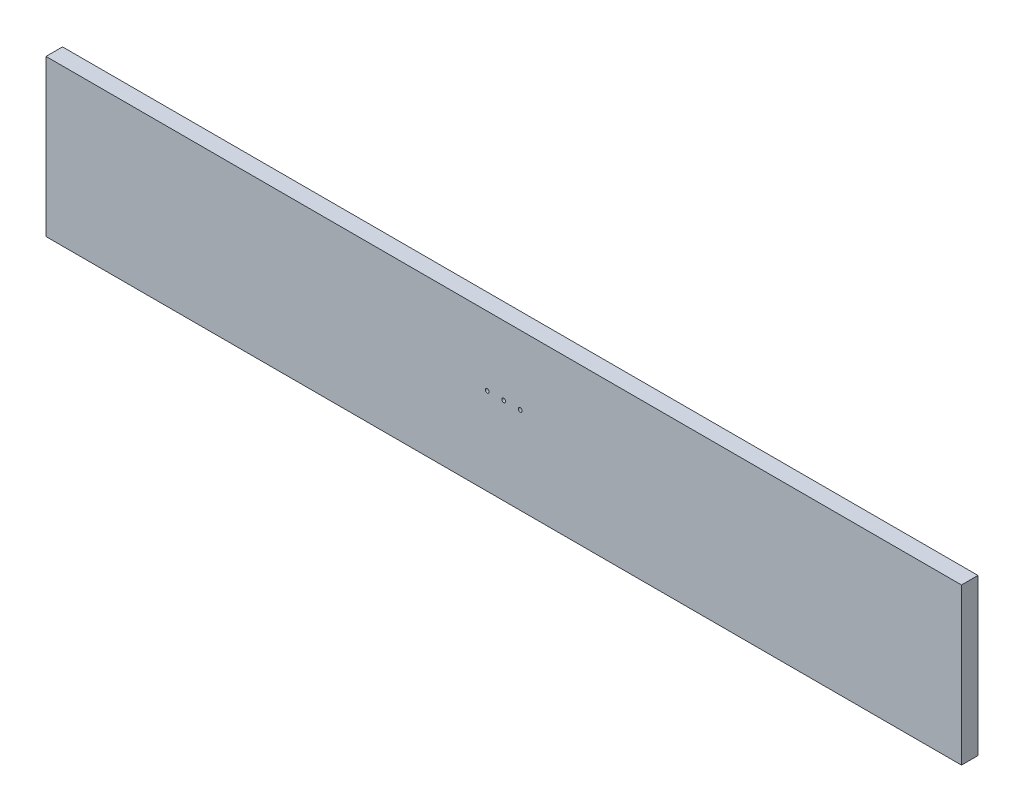
ISO-10303-21;
HEADER;
FILE_DESCRIPTION(('STEP AP214'),'2;1');
FILE_NAME('part.step','',(''),(''),'','','');
FILE_SCHEMA(('AUTOMOTIVE_DESIGN { 1 0 10303 214 1 1 1 1 }'));
ENDSEC;
DATA;
#1=APPLICATION_CONTEXT('core data for automotive mechanical design processes');
#2=APPLICATION_PROTOCOL_DEFINITION('international standard','automotive_design',2000,#1);
#3=PRODUCT_CONTEXT('',#1,'mechanical');
#4=PRODUCT('Part','Part','',(#3));
#5=PRODUCT_RELATED_PRODUCT_CATEGORY('part','',(#4));
#6=PRODUCT_DEFINITION_FORMATION('','',#4);
#7=PRODUCT_DEFINITION_CONTEXT('part definition',#1,'design');
#8=PRODUCT_DEFINITION('design','',#6,#7);
#9=PRODUCT_DEFINITION_SHAPE('','',#8);
#10=(LENGTH_UNIT() NAMED_UNIT(*) SI_UNIT(.MILLI.,.METRE.));
#11=(NAMED_UNIT(*) PLANE_ANGLE_UNIT() SI_UNIT($,.RADIAN.));
#12=(NAMED_UNIT(*) SI_UNIT($,.STERADIAN.) SOLID_ANGLE_UNIT());
#13=UNCERTAINTY_MEASURE_WITH_UNIT(LENGTH_MEASURE(1.E-05),#10,'distance_accuracy_value','');
#14=(GEOMETRIC_REPRESENTATION_CONTEXT(3) GLOBAL_UNCERTAINTY_ASSIGNED_CONTEXT((#13)) GLOBAL_UNIT_ASSIGNED_CONTEXT((#10,
#11,#12)) REPRESENTATION_CONTEXT('',''));
#15=CARTESIAN_POINT('',(0.,0.,0.));
#16=DIRECTION('',(0.,0.,1.));
#17=DIRECTION('',(1.,0.,0.));
#18=AXIS2_PLACEMENT_3D('',#15,#16,#17);
#19=CARTESIAN_POINT('',(352.,60.,12.7));
#20=DIRECTION('',(-1.,0.,0.));
#21=DIRECTION('',(0.,0.,1.));
#22=AXIS2_PLACEMENT_3D('',#19,#20,#21);
#23=PLANE('',#22);
#24=DIRECTION('',(0.,1.,0.));
#25=VECTOR('',#24,1.);
#26=CARTESIAN_POINT('',(352.,60.,0.));
#27=LINE('',#26,#25);
#28=CARTESIAN_POINT('',(352.,-60.,0.));
#29=VERTEX_POINT('',#28);
#30=CARTESIAN_POINT('',(352.,60.,0.));
#31=VERTEX_POINT('',#30);
#32=EDGE_CURVE('E104',#29,#31,#27,.T.);
#33=ORIENTED_EDGE('',*,*,#32,.T.);
#34=DIRECTION('',(0.,0.,-1.));
#35=VECTOR('',#34,1.);
#36=CARTESIAN_POINT('',(352.,60.,12.7));
#37=LINE('',#36,#35);
#38=CARTESIAN_POINT('',(352.,60.,12.7));
#39=VERTEX_POINT('',#38);
#40=EDGE_CURVE('E11',#39,#31,#37,.T.);
#41=ORIENTED_EDGE('',*,*,#40,.F.);
#42=DIRECTION('',(0.,1.,0.));
#43=VECTOR('',#42,1.);
#44=CARTESIAN_POINT('',(352.,60.,12.7));
#45=LINE('',#44,#43);
#46=CARTESIAN_POINT('',(352.,-60.,12.7));
#47=VERTEX_POINT('',#46);
#48=EDGE_CURVE('E92',#47,#39,#45,.T.);
#49=ORIENTED_EDGE('',*,*,#48,.F.);
#50=DIRECTION('',(0.,0.,-1.));
#51=VECTOR('',#50,1.);
#52=CARTESIAN_POINT('',(352.,-60.,12.7));
#53=LINE('',#52,#51);
#54=EDGE_CURVE('E100',#47,#29,#53,.T.);
#55=ORIENTED_EDGE('',*,*,#54,.T.);
#56=EDGE_LOOP('',(#33,#41,#49,#55));
#57=FACE_BOUND('',#56,.T.);
#58=ADVANCED_FACE('F41',(#57),#23,.F.);
#59=CARTESIAN_POINT('',(-352.,60.,12.7));
#60=DIRECTION('',(0.,-1.,0.));
#61=DIRECTION('',(0.,0.,-1.));
#62=AXIS2_PLACEMENT_3D('',#59,#60,#61);
#63=PLANE('',#62);
#64=DIRECTION('',(-1.,0.,0.));
#65=VECTOR('',#64,1.);
#66=CARTESIAN_POINT('',(-352.,60.,0.));
#67=LINE('',#66,#65);
#68=CARTESIAN_POINT('',(-352.,60.,0.));
#69=VERTEX_POINT('',#68);
#70=EDGE_CURVE('E96',#31,#69,#67,.T.);
#71=ORIENTED_EDGE('',*,*,#70,.T.);
#72=DIRECTION('',(0.,0.,-1.));
#73=VECTOR('',#72,1.);
#74=CARTESIAN_POINT('',(-352.,60.,12.7));
#75=LINE('',#74,#73);
#76=CARTESIAN_POINT('',(-352.,60.,12.7));
#77=VERTEX_POINT('',#76);
#78=EDGE_CURVE('E49',#77,#69,#75,.T.);
#79=ORIENTED_EDGE('',*,*,#78,.F.);
#80=DIRECTION('',(-1.,0.,0.));
#81=VECTOR('',#80,1.);
#82=CARTESIAN_POINT('',(-352.,60.,12.7));
#83=LINE('',#82,#81);
#84=EDGE_CURVE('E87',#39,#77,#83,.T.);
#85=ORIENTED_EDGE('',*,*,#84,.F.);
#86=ORIENTED_EDGE('',*,*,#40,.T.);
#87=EDGE_LOOP('',(#71,#79,#85,#86));
#88=FACE_BOUND('',#87,.T.);
#89=ADVANCED_FACE('F95',(#88),#63,.F.);
#90=CARTESIAN_POINT('',(-352.,60.,12.7));
#91=DIRECTION('',(1.,0.,0.));
#92=DIRECTION('',(0.,0.,-1.));
#93=AXIS2_PLACEMENT_3D('',#90,#91,#92);
#94=PLANE('',#93);
#95=DIRECTION('',(0.,-1.,0.));
#96=VECTOR('',#95,1.);
#97=CARTESIAN_POINT('',(-352.,60.,0.));
#98=LINE('',#97,#96);
#99=CARTESIAN_POINT('',(-352.,-60.,0.));
#100=VERTEX_POINT('',#99);
#101=EDGE_CURVE('E74',#69,#100,#98,.T.);
#102=ORIENTED_EDGE('',*,*,#101,.T.);
#103=DIRECTION('',(0.,0.,-1.));
#104=VECTOR('',#103,1.);
#105=CARTESIAN_POINT('',(-352.,-60.,12.7));
#106=LINE('',#105,#104);
#107=CARTESIAN_POINT('',(-352.,-60.,12.7));
#108=VERTEX_POINT('',#107);
#109=EDGE_CURVE('E97',#108,#100,#106,.T.);
#110=ORIENTED_EDGE('',*,*,#109,.F.);
#111=DIRECTION('',(0.,-1.,0.));
#112=VECTOR('',#111,1.);
#113=CARTESIAN_POINT('',(-352.,60.,12.7));
#114=LINE('',#113,#112);
#115=EDGE_CURVE('E90',#77,#108,#114,.T.);
#116=ORIENTED_EDGE('',*,*,#115,.F.);
#117=ORIENTED_EDGE('',*,*,#78,.T.);
#118=EDGE_LOOP('',(#102,#110,#116,#117));
#119=FACE_BOUND('',#118,.T.);
#120=ADVANCED_FACE('F98',(#119),#94,.F.);
#121=CARTESIAN_POINT('',(-352.,-60.,12.7));
#122=DIRECTION('',(0.,1.,0.));
#123=DIRECTION('',(0.,0.,1.));
#124=AXIS2_PLACEMENT_3D('',#121,#122,#123);
#125=PLANE('',#124);
#126=DIRECTION('',(1.,0.,0.));
#127=VECTOR('',#126,1.);
#128=CARTESIAN_POINT('',(-352.,-60.,0.));
#129=LINE('',#128,#127);
#130=EDGE_CURVE('E80',#100,#29,#129,.T.);
#131=ORIENTED_EDGE('',*,*,#130,.T.);
#132=ORIENTED_EDGE('',*,*,#54,.F.);
#133=DIRECTION('',(1.,0.,0.));
#134=VECTOR('',#133,1.);
#135=CARTESIAN_POINT('',(-352.,-60.,12.7));
#136=LINE('',#135,#134);
#137=EDGE_CURVE('E57',#108,#47,#136,.T.);
#138=ORIENTED_EDGE('',*,*,#137,.F.);
#139=ORIENTED_EDGE('',*,*,#109,.T.);
#140=EDGE_LOOP('',(#131,#132,#138,#139));
#141=FACE_BOUND('',#140,.T.);
#142=ADVANCED_FACE('F112',(#141),#125,.F.);
#143=CARTESIAN_POINT('',(0.,0.,12.7));
#144=DIRECTION('',(0.,0.,1.));
#145=DIRECTION('',(1.,0.,0.));
#146=AXIS2_PLACEMENT_3D('',#143,#144,#145);
#147=PLANE('',#146);
#148=CARTESIAN_POINT('',(12.6899999999999,6.92,12.7));
#149=DIRECTION('',(0.,0.,1.));
#150=DIRECTION('',(1.,0.,0.));
#151=AXIS2_PLACEMENT_3D('',#148,#149,#150);
#152=CIRCLE('',#151,1.5);
#153=CARTESIAN_POINT('',(14.1899999999999,6.92,12.7));
#154=VERTEX_POINT('',#153);
#155=EDGE_CURVE('E130',#154,#154,#152,.T.);
#156=ORIENTED_EDGE('',*,*,#155,.F.);
#157=EDGE_LOOP('',(#156));
#158=FACE_BOUND('',#157,.T.);
#159=CARTESIAN_POINT('',(-0.0100000000000759,6.91999999999991,12.7));
#160=DIRECTION('',(0.,0.,1.));
#161=DIRECTION('',(1.,0.,0.));
#162=AXIS2_PLACEMENT_3D('',#159,#160,#161);
#163=CIRCLE('',#162,1.5);
#164=CARTESIAN_POINT('',(1.48999999999992,6.91999999999991,12.7));
#165=VERTEX_POINT('',#164);
#166=EDGE_CURVE('E127',#165,#165,#163,.T.);
#167=ORIENTED_EDGE('',*,*,#166,.F.);
#168=EDGE_LOOP('',(#167));
#169=FACE_BOUND('',#168,.T.);
#170=CARTESIAN_POINT('',(-12.7100000000001,6.91999999999983,12.7));
#171=DIRECTION('',(0.,0.,1.));
#172=DIRECTION('',(1.,0.,0.));
#173=AXIS2_PLACEMENT_3D('',#170,#171,#172);
#174=CIRCLE('',#173,1.5);
#175=CARTESIAN_POINT('',(-11.2100000000001,6.91999999999983,12.7));
#176=VERTEX_POINT('',#175);
#177=EDGE_CURVE('E121',#176,#176,#174,.T.);
#178=ORIENTED_EDGE('',*,*,#177,.F.);
#179=EDGE_LOOP('',(#178));
#180=FACE_BOUND('',#179,.T.);
#181=ORIENTED_EDGE('',*,*,#48,.T.);
#182=ORIENTED_EDGE('',*,*,#84,.T.);
#183=ORIENTED_EDGE('',*,*,#115,.T.);
#184=ORIENTED_EDGE('',*,*,#137,.T.);
#185=EDGE_LOOP('',(#181,#182,#183,#184));
#186=FACE_BOUND('',#185,.T.);
#187=ADVANCED_FACE('F88',(#158,#169,#180,#186),#147,.T.);
#188=CARTESIAN_POINT('',(0.,0.,0.));
#189=DIRECTION('',(0.,0.,1.));
#190=DIRECTION('',(1.,0.,0.));
#191=AXIS2_PLACEMENT_3D('',#188,#189,#190);
#192=PLANE('',#191);
#193=CARTESIAN_POINT('',(12.6899999999999,6.92,0.));
#194=DIRECTION('',(0.,0.,1.));
#195=DIRECTION('',(1.,0.,0.));
#196=AXIS2_PLACEMENT_3D('',#193,#194,#195);
#197=CIRCLE('',#196,1.5);
#198=CARTESIAN_POINT('',(14.1899999999999,6.92,0.));
#199=VERTEX_POINT('',#198);
#200=EDGE_CURVE('E107',#199,#199,#197,.T.);
#201=ORIENTED_EDGE('',*,*,#200,.T.);
#202=EDGE_LOOP('',(#201));
#203=FACE_BOUND('',#202,.T.);
#204=CARTESIAN_POINT('',(-0.0100000000000759,6.91999999999991,0.));
#205=DIRECTION('',(0.,0.,1.));
#206=DIRECTION('',(1.,0.,0.));
#207=AXIS2_PLACEMENT_3D('',#204,#205,#206);
#208=CIRCLE('',#207,1.5);
#209=CARTESIAN_POINT('',(1.48999999999992,6.91999999999991,0.));
#210=VERTEX_POINT('',#209);
#211=EDGE_CURVE('E124',#210,#210,#208,.T.);
#212=ORIENTED_EDGE('',*,*,#211,.T.);
#213=EDGE_LOOP('',(#212));
#214=FACE_BOUND('',#213,.T.);
#215=CARTESIAN_POINT('',(-12.7100000000001,6.91999999999983,0.));
#216=DIRECTION('',(0.,0.,1.));
#217=DIRECTION('',(1.,0.,0.));
#218=AXIS2_PLACEMENT_3D('',#215,#216,#217);
#219=CIRCLE('',#218,1.5);
#220=CARTESIAN_POINT('',(-11.2100000000001,6.91999999999983,0.));
#221=VERTEX_POINT('',#220);
#222=EDGE_CURVE('E118',#221,#221,#219,.T.);
#223=ORIENTED_EDGE('',*,*,#222,.T.);
#224=EDGE_LOOP('',(#223));
#225=FACE_BOUND('',#224,.T.);
#226=ORIENTED_EDGE('',*,*,#32,.F.);
#227=ORIENTED_EDGE('',*,*,#130,.F.);
#228=ORIENTED_EDGE('',*,*,#101,.F.);
#229=ORIENTED_EDGE('',*,*,#70,.F.);
#230=EDGE_LOOP('',(#226,#227,#228,#229));
#231=FACE_BOUND('',#230,.T.);
#232=ADVANCED_FACE('F115',(#203,#214,#225,#231),#192,.F.);
#233=CARTESIAN_POINT('',(-12.7100000000001,6.91999999999983,0.));
#234=DIRECTION('',(0.,0.,1.));
#235=DIRECTION('',(1.,0.,0.));
#236=AXIS2_PLACEMENT_3D('',#233,#234,#235);
#237=CYLINDRICAL_SURFACE('',#236,1.5);
#238=ORIENTED_EDGE('',*,*,#222,.F.);
#239=EDGE_LOOP('',(#238));
#240=FACE_BOUND('',#239,.T.);
#241=ORIENTED_EDGE('',*,*,#177,.T.);
#242=EDGE_LOOP('',(#241));
#243=FACE_BOUND('',#242,.T.);
#244=ADVANCED_FACE('F152',(#240,#243),#237,.F.);
#245=CARTESIAN_POINT('',(-0.0100000000000759,6.91999999999991,0.));
#246=DIRECTION('',(0.,0.,1.));
#247=DIRECTION('',(1.,0.,0.));
#248=AXIS2_PLACEMENT_3D('',#245,#246,#247);
#249=CYLINDRICAL_SURFACE('',#248,1.5);
#250=ORIENTED_EDGE('',*,*,#211,.F.);
#251=EDGE_LOOP('',(#250));
#252=FACE_BOUND('',#251,.T.);
#253=ORIENTED_EDGE('',*,*,#166,.T.);
#254=EDGE_LOOP('',(#253));
#255=FACE_BOUND('',#254,.T.);
#256=ADVANCED_FACE('F141',(#252,#255),#249,.F.);
#257=CARTESIAN_POINT('',(12.6899999999999,6.92,0.));
#258=DIRECTION('',(0.,0.,1.));
#259=DIRECTION('',(1.,0.,0.));
#260=AXIS2_PLACEMENT_3D('',#257,#258,#259);
#261=CYLINDRICAL_SURFACE('',#260,1.5);
#262=ORIENTED_EDGE('',*,*,#200,.F.);
#263=EDGE_LOOP('',(#262));
#264=FACE_BOUND('',#263,.T.);
#265=ORIENTED_EDGE('',*,*,#155,.T.);
#266=EDGE_LOOP('',(#265));
#267=FACE_BOUND('',#266,.T.);
#268=ADVANCED_FACE('F138',(#264,#267),#261,.F.);
#269=CLOSED_SHELL('',(#58,#89,#120,#142,#187,#232,#244,#256,#268));
#270=MANIFOLD_SOLID_BREP('B2',#269);
#271=ADVANCED_BREP_SHAPE_REPRESENTATION('',(#18,#270),#14);
#272=SHAPE_DEFINITION_REPRESENTATION(#9,#271);
ENDSEC;
END-ISO-10303-21;
